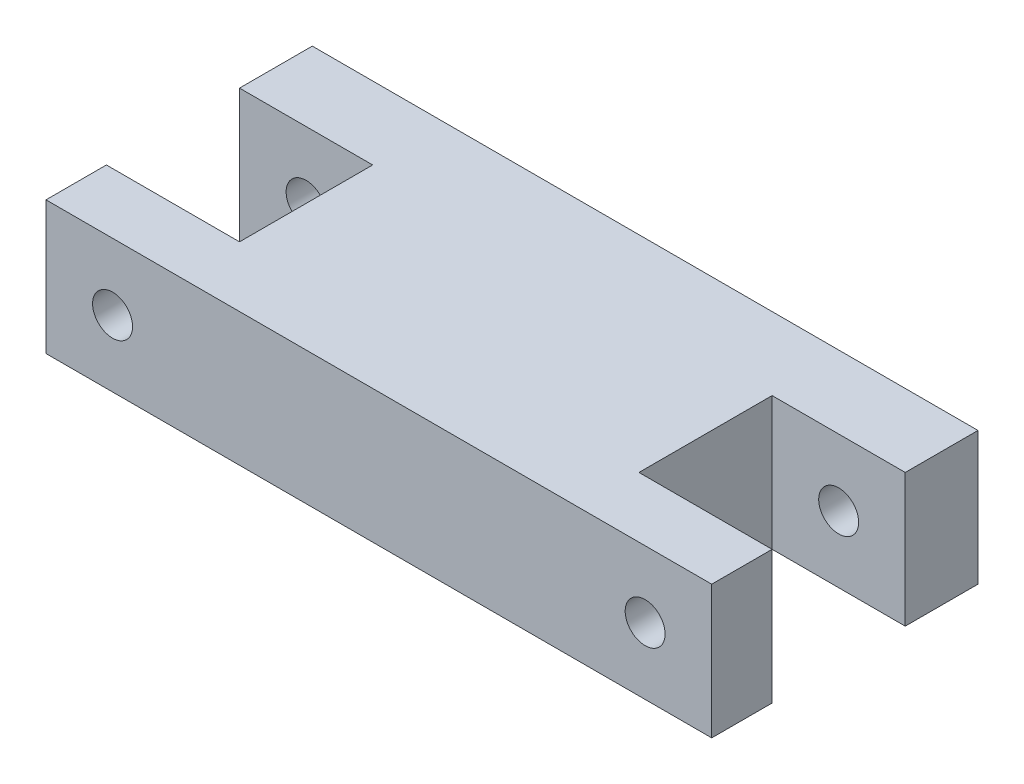
ISO-10303-21;
HEADER;
FILE_DESCRIPTION(('STEP AP214'),'2;1');
FILE_NAME('part.step','',(''),(''),'','','');
FILE_SCHEMA(('AUTOMOTIVE_DESIGN { 1 0 10303 214 1 1 1 1 }'));
ENDSEC;
DATA;
#1=APPLICATION_CONTEXT('core data for automotive mechanical design processes');
#2=APPLICATION_PROTOCOL_DEFINITION('international standard','automotive_design',2000,#1);
#3=PRODUCT_CONTEXT('',#1,'mechanical');
#4=PRODUCT('Part','Part','',(#3));
#5=PRODUCT_RELATED_PRODUCT_CATEGORY('part','',(#4));
#6=PRODUCT_DEFINITION_FORMATION('','',#4);
#7=PRODUCT_DEFINITION_CONTEXT('part definition',#1,'design');
#8=PRODUCT_DEFINITION('design','',#6,#7);
#9=PRODUCT_DEFINITION_SHAPE('','',#8);
#10=(LENGTH_UNIT() NAMED_UNIT(*) SI_UNIT(.MILLI.,.METRE.));
#11=(NAMED_UNIT(*) PLANE_ANGLE_UNIT() SI_UNIT($,.RADIAN.));
#12=(NAMED_UNIT(*) SI_UNIT($,.STERADIAN.) SOLID_ANGLE_UNIT());
#13=UNCERTAINTY_MEASURE_WITH_UNIT(LENGTH_MEASURE(1.E-05),#10,'distance_accuracy_value','');
#14=(GEOMETRIC_REPRESENTATION_CONTEXT(3) GLOBAL_UNCERTAINTY_ASSIGNED_CONTEXT((#13)) GLOBAL_UNIT_ASSIGNED_CONTEXT((#10,
#11,#12)) REPRESENTATION_CONTEXT('',''));
#15=CARTESIAN_POINT('',(0.,0.,0.));
#16=DIRECTION('',(0.,0.,1.));
#17=DIRECTION('',(1.,0.,0.));
#18=AXIS2_PLACEMENT_3D('',#15,#16,#17);
#19=CARTESIAN_POINT('',(-50.,10.,40.));
#20=DIRECTION('',(0.,-1.,0.));
#21=DIRECTION('',(0.,0.,-1.));
#22=AXIS2_PLACEMENT_3D('',#19,#20,#21);
#23=PLANE('',#22);
#24=DIRECTION('',(1.,0.,0.));
#25=VECTOR('',#24,1.);
#26=CARTESIAN_POINT('',(-50.,10.,10.9284682851718));
#27=LINE('',#26,#25);
#28=CARTESIAN_POINT('',(-50.,10.,10.9284682851718));
#29=VERTEX_POINT('',#28);
#30=CARTESIAN_POINT('',(-30.,10.,10.9284682851718));
#31=VERTEX_POINT('',#30);
#32=EDGE_CURVE('E135',#29,#31,#27,.T.);
#33=ORIENTED_EDGE('',*,*,#32,.T.);
#34=DIRECTION('',(0.,0.,1.));
#35=VECTOR('',#34,1.);
#36=CARTESIAN_POINT('',(-30.,10.,30.9284682851718));
#37=LINE('',#36,#35);
#38=CARTESIAN_POINT('',(-30.,10.,30.9284682851718));
#39=VERTEX_POINT('',#38);
#40=EDGE_CURVE('E150',#31,#39,#37,.T.);
#41=ORIENTED_EDGE('',*,*,#40,.T.);
#42=DIRECTION('',(-1.,0.,0.));
#43=VECTOR('',#42,1.);
#44=CARTESIAN_POINT('',(-50.,10.,30.9284682851717));
#45=LINE('',#44,#43);
#46=CARTESIAN_POINT('',(-50.,10.,30.9284682851717));
#47=VERTEX_POINT('',#46);
#48=EDGE_CURVE('E196',#39,#47,#45,.T.);
#49=ORIENTED_EDGE('',*,*,#48,.T.);
#50=DIRECTION('',(0.,0.,-1.));
#51=VECTOR('',#50,1.);
#52=CARTESIAN_POINT('',(-50.,10.,40.));
#53=LINE('',#52,#51);
#54=CARTESIAN_POINT('',(-50.,10.,40.));
#55=VERTEX_POINT('',#54);
#56=EDGE_CURVE('E166',#55,#47,#53,.T.);
#57=ORIENTED_EDGE('',*,*,#56,.F.);
#58=DIRECTION('',(-1.,0.,0.));
#59=VECTOR('',#58,1.);
#60=CARTESIAN_POINT('',(-50.,10.,40.));
#61=LINE('',#60,#59);
#62=CARTESIAN_POINT('',(50.,10.,40.));
#63=VERTEX_POINT('',#62);
#64=EDGE_CURVE('E233',#63,#55,#61,.T.);
#65=ORIENTED_EDGE('',*,*,#64,.F.);
#66=DIRECTION('',(0.,0.,-1.));
#67=VECTOR('',#66,1.);
#68=CARTESIAN_POINT('',(50.,10.,40.));
#69=LINE('',#68,#67);
#70=CARTESIAN_POINT('',(50.,10.,30.9284682851717));
#71=VERTEX_POINT('',#70);
#72=EDGE_CURVE('E11',#63,#71,#69,.T.);
#73=ORIENTED_EDGE('',*,*,#72,.T.);
#74=DIRECTION('',(1.,0.,0.));
#75=VECTOR('',#74,1.);
#76=CARTESIAN_POINT('',(50.,10.,30.9284682851717));
#77=LINE('',#76,#75);
#78=CARTESIAN_POINT('',(30.,10.,30.9284682851718));
#79=VERTEX_POINT('',#78);
#80=EDGE_CURVE('E210',#79,#71,#77,.T.);
#81=ORIENTED_EDGE('',*,*,#80,.F.);
#82=DIRECTION('',(0.,0.,1.));
#83=VECTOR('',#82,1.);
#84=CARTESIAN_POINT('',(30.,10.,30.9284682851718));
#85=LINE('',#84,#83);
#86=CARTESIAN_POINT('',(30.,10.,10.9284682851718));
#87=VERTEX_POINT('',#86);
#88=EDGE_CURVE('E217',#87,#79,#85,.T.);
#89=ORIENTED_EDGE('',*,*,#88,.F.);
#90=DIRECTION('',(-1.,0.,0.));
#91=VECTOR('',#90,1.);
#92=CARTESIAN_POINT('',(50.,10.,10.9284682851718));
#93=LINE('',#92,#91);
#94=CARTESIAN_POINT('',(50.,10.,10.9284682851718));
#95=VERTEX_POINT('',#94);
#96=EDGE_CURVE('E203',#95,#87,#93,.T.);
#97=ORIENTED_EDGE('',*,*,#96,.F.);
#98=CARTESIAN_POINT('',(50.,10.,0.));
#99=VERTEX_POINT('',#98);
#100=EDGE_CURVE('E47',#95,#99,#69,.T.);
#101=ORIENTED_EDGE('',*,*,#100,.T.);
#102=DIRECTION('',(-1.,0.,0.));
#103=VECTOR('',#102,1.);
#104=CARTESIAN_POINT('',(-50.,10.,0.));
#105=LINE('',#104,#103);
#106=CARTESIAN_POINT('',(-50.,10.,0.));
#107=VERTEX_POINT('',#106);
#108=EDGE_CURVE('E242',#99,#107,#105,.T.);
#109=ORIENTED_EDGE('',*,*,#108,.T.);
#110=EDGE_CURVE('E160',#29,#107,#53,.T.);
#111=ORIENTED_EDGE('',*,*,#110,.F.);
#112=EDGE_LOOP('',(#33,#41,#49,#57,#65,#73,#81,#89,#97,#101,#109,#111));
#113=FACE_BOUND('',#112,.T.);
#114=ADVANCED_FACE('F38',(#113),#23,.F.);
#115=CARTESIAN_POINT('',(-50.,10.,40.));
#116=DIRECTION('',(1.,0.,0.));
#117=DIRECTION('',(0.,1.,0.));
#118=AXIS2_PLACEMENT_3D('',#115,#116,#117);
#119=PLANE('',#118);
#120=DIRECTION('',(0.,1.,0.));
#121=VECTOR('',#120,1.);
#122=CARTESIAN_POINT('',(-50.,-10.,10.9284682851718));
#123=LINE('',#122,#121);
#124=CARTESIAN_POINT('',(-50.,-10.,10.9284682851718));
#125=VERTEX_POINT('',#124);
#126=EDGE_CURVE('E128',#125,#29,#123,.T.);
#127=ORIENTED_EDGE('',*,*,#126,.T.);
#128=ORIENTED_EDGE('',*,*,#110,.T.);
#129=DIRECTION('',(0.,-1.,0.));
#130=VECTOR('',#129,1.);
#131=CARTESIAN_POINT('',(-50.,10.,0.));
#132=LINE('',#131,#130);
#133=CARTESIAN_POINT('',(-50.,-10.,0.));
#134=VERTEX_POINT('',#133);
#135=EDGE_CURVE('E154',#107,#134,#132,.T.);
#136=ORIENTED_EDGE('',*,*,#135,.T.);
#137=DIRECTION('',(0.,0.,-1.));
#138=VECTOR('',#137,1.);
#139=CARTESIAN_POINT('',(-50.,-10.,40.));
#140=LINE('',#139,#138);
#141=EDGE_CURVE('E146',#125,#134,#140,.T.);
#142=ORIENTED_EDGE('',*,*,#141,.F.);
#143=EDGE_LOOP('',(#127,#128,#136,#142));
#144=FACE_BOUND('',#143,.T.);
#145=ADVANCED_FACE('F152',(#144),#119,.F.);
#146=DIRECTION('',(0.,1.,0.));
#147=VECTOR('',#146,1.);
#148=CARTESIAN_POINT('',(-50.,-10.,30.9284682851717));
#149=LINE('',#148,#147);
#150=CARTESIAN_POINT('',(-50.,-10.,30.9284682851717));
#151=VERTEX_POINT('',#150);
#152=EDGE_CURVE('E139',#151,#47,#149,.T.);
#153=ORIENTED_EDGE('',*,*,#152,.F.);
#154=CARTESIAN_POINT('',(-50.,-10.,40.));
#155=VERTEX_POINT('',#154);
#156=EDGE_CURVE('E156',#155,#151,#140,.T.);
#157=ORIENTED_EDGE('',*,*,#156,.F.);
#158=DIRECTION('',(0.,-1.,0.));
#159=VECTOR('',#158,1.);
#160=CARTESIAN_POINT('',(-50.,10.,40.));
#161=LINE('',#160,#159);
#162=EDGE_CURVE('E236',#55,#155,#161,.T.);
#163=ORIENTED_EDGE('',*,*,#162,.F.);
#164=ORIENTED_EDGE('',*,*,#56,.T.);
#165=EDGE_LOOP('',(#153,#157,#163,#164));
#166=FACE_BOUND('',#165,.T.);
#167=ADVANCED_FACE('F275',(#166),#119,.F.);
#168=CARTESIAN_POINT('',(-50.,-10.,40.));
#169=DIRECTION('',(0.,1.,0.));
#170=DIRECTION('',(0.,0.,1.));
#171=AXIS2_PLACEMENT_3D('',#168,#169,#170);
#172=PLANE('',#171);
#173=DIRECTION('',(1.,0.,0.));
#174=VECTOR('',#173,1.);
#175=CARTESIAN_POINT('',(-50.,-10.,10.9284682851718));
#176=LINE('',#175,#174);
#177=CARTESIAN_POINT('',(-30.,-10.,10.9284682851718));
#178=VERTEX_POINT('',#177);
#179=EDGE_CURVE('E132',#125,#178,#176,.T.);
#180=ORIENTED_EDGE('',*,*,#179,.F.);
#181=ORIENTED_EDGE('',*,*,#141,.T.);
#182=DIRECTION('',(1.,0.,0.));
#183=VECTOR('',#182,1.);
#184=CARTESIAN_POINT('',(-50.,-10.,0.));
#185=LINE('',#184,#183);
#186=CARTESIAN_POINT('',(50.,-10.,0.));
#187=VERTEX_POINT('',#186);
#188=EDGE_CURVE('E234',#134,#187,#185,.T.);
#189=ORIENTED_EDGE('',*,*,#188,.T.);
#190=DIRECTION('',(0.,0.,-1.));
#191=VECTOR('',#190,1.);
#192=CARTESIAN_POINT('',(50.,-10.,40.));
#193=LINE('',#192,#191);
#194=CARTESIAN_POINT('',(50.,-10.,10.9284682851718));
#195=VERTEX_POINT('',#194);
#196=EDGE_CURVE('E162',#195,#187,#193,.T.);
#197=ORIENTED_EDGE('',*,*,#196,.F.);
#198=DIRECTION('',(-1.,0.,0.));
#199=VECTOR('',#198,1.);
#200=CARTESIAN_POINT('',(50.,-10.,10.9284682851718));
#201=LINE('',#200,#199);
#202=CARTESIAN_POINT('',(30.,-10.,10.9284682851718));
#203=VERTEX_POINT('',#202);
#204=EDGE_CURVE('E206',#195,#203,#201,.T.);
#205=ORIENTED_EDGE('',*,*,#204,.T.);
#206=DIRECTION('',(0.,0.,1.));
#207=VECTOR('',#206,1.);
#208=CARTESIAN_POINT('',(30.,-10.,30.9284682851718));
#209=LINE('',#208,#207);
#210=CARTESIAN_POINT('',(30.,-10.,30.9284682851718));
#211=VERTEX_POINT('',#210);
#212=EDGE_CURVE('E209',#203,#211,#209,.T.);
#213=ORIENTED_EDGE('',*,*,#212,.T.);
#214=DIRECTION('',(1.,0.,0.));
#215=VECTOR('',#214,1.);
#216=CARTESIAN_POINT('',(50.,-10.,30.9284682851717));
#217=LINE('',#216,#215);
#218=CARTESIAN_POINT('',(50.,-10.,30.9284682851717));
#219=VERTEX_POINT('',#218);
#220=EDGE_CURVE('E63',#211,#219,#217,.T.);
#221=ORIENTED_EDGE('',*,*,#220,.T.);
#222=CARTESIAN_POINT('',(50.,-10.,40.));
#223=VERTEX_POINT('',#222);
#224=EDGE_CURVE('E157',#223,#219,#193,.T.);
#225=ORIENTED_EDGE('',*,*,#224,.F.);
#226=DIRECTION('',(1.,0.,0.));
#227=VECTOR('',#226,1.);
#228=CARTESIAN_POINT('',(-50.,-10.,40.));
#229=LINE('',#228,#227);
#230=EDGE_CURVE('E238',#155,#223,#229,.T.);
#231=ORIENTED_EDGE('',*,*,#230,.F.);
#232=ORIENTED_EDGE('',*,*,#156,.T.);
#233=DIRECTION('',(-1.,0.,0.));
#234=VECTOR('',#233,1.);
#235=CARTESIAN_POINT('',(-50.,-10.,30.9284682851717));
#236=LINE('',#235,#234);
#237=CARTESIAN_POINT('',(-30.,-10.,30.9284682851718));
#238=VERTEX_POINT('',#237);
#239=EDGE_CURVE('E149',#238,#151,#236,.T.);
#240=ORIENTED_EDGE('',*,*,#239,.F.);
#241=DIRECTION('',(0.,0.,1.));
#242=VECTOR('',#241,1.);
#243=CARTESIAN_POINT('',(-30.,-10.,30.9284682851718));
#244=LINE('',#243,#242);
#245=EDGE_CURVE('E140',#178,#238,#244,.T.);
#246=ORIENTED_EDGE('',*,*,#245,.F.);
#247=EDGE_LOOP('',(#180,#181,#189,#197,#205,#213,#221,#225,#231,#232,#240,#246));
#248=FACE_BOUND('',#247,.T.);
#249=ADVANCED_FACE('F144',(#248),#172,.F.);
#250=CARTESIAN_POINT('',(50.,10.,40.));
#251=DIRECTION('',(-1.,0.,0.));
#252=DIRECTION('',(0.,0.,1.));
#253=AXIS2_PLACEMENT_3D('',#250,#251,#252);
#254=PLANE('',#253);
#255=ORIENTED_EDGE('',*,*,#100,.F.);
#256=DIRECTION('',(0.,1.,0.));
#257=VECTOR('',#256,1.);
#258=CARTESIAN_POINT('',(50.,-10.,10.9284682851718));
#259=LINE('',#258,#257);
#260=EDGE_CURVE('E221',#195,#95,#259,.T.);
#261=ORIENTED_EDGE('',*,*,#260,.F.);
#262=ORIENTED_EDGE('',*,*,#196,.T.);
#263=DIRECTION('',(0.,1.,0.));
#264=VECTOR('',#263,1.);
#265=CARTESIAN_POINT('',(50.,10.,0.));
#266=LINE('',#265,#264);
#267=EDGE_CURVE('E223',#187,#99,#266,.T.);
#268=ORIENTED_EDGE('',*,*,#267,.T.);
#269=EDGE_LOOP('',(#255,#261,#262,#268));
#270=FACE_BOUND('',#269,.T.);
#271=ADVANCED_FACE('F252',(#270),#254,.F.);
#272=ORIENTED_EDGE('',*,*,#224,.T.);
#273=DIRECTION('',(0.,1.,0.));
#274=VECTOR('',#273,1.);
#275=CARTESIAN_POINT('',(50.,-10.,30.9284682851717));
#276=LINE('',#275,#274);
#277=EDGE_CURVE('E224',#219,#71,#276,.T.);
#278=ORIENTED_EDGE('',*,*,#277,.T.);
#279=ORIENTED_EDGE('',*,*,#72,.F.);
#280=DIRECTION('',(0.,1.,0.));
#281=VECTOR('',#280,1.);
#282=CARTESIAN_POINT('',(50.,10.,40.));
#283=LINE('',#282,#281);
#284=EDGE_CURVE('E230',#223,#63,#283,.T.);
#285=ORIENTED_EDGE('',*,*,#284,.F.);
#286=EDGE_LOOP('',(#272,#278,#279,#285));
#287=FACE_BOUND('',#286,.T.);
#288=ADVANCED_FACE('F40',(#287),#254,.F.);
#289=CARTESIAN_POINT('',(0.,0.,40.));
#290=DIRECTION('',(0.,0.,1.));
#291=DIRECTION('',(1.,0.,0.));
#292=AXIS2_PLACEMENT_3D('',#289,#290,#291);
#293=PLANE('',#292);
#294=CARTESIAN_POINT('',(-40.,0.,40.));
#295=DIRECTION('',(0.,0.,-1.));
#296=DIRECTION('',(-1.,0.,0.));
#297=AXIS2_PLACEMENT_3D('',#294,#295,#296);
#298=CIRCLE('',#297,3.);
#299=CARTESIAN_POINT('',(-43.,0.,40.));
#300=VERTEX_POINT('',#299);
#301=EDGE_CURVE('E182',#300,#300,#298,.T.);
#302=ORIENTED_EDGE('',*,*,#301,.T.);
#303=EDGE_LOOP('',(#302));
#304=FACE_BOUND('',#303,.T.);
#305=CARTESIAN_POINT('',(40.,0.,40.));
#306=DIRECTION('',(0.,0.,1.));
#307=DIRECTION('',(1.,0.,0.));
#308=AXIS2_PLACEMENT_3D('',#305,#306,#307);
#309=CIRCLE('',#308,3.);
#310=CARTESIAN_POINT('',(43.,0.,40.));
#311=VERTEX_POINT('',#310);
#312=EDGE_CURVE('E171',#311,#311,#309,.T.);
#313=ORIENTED_EDGE('',*,*,#312,.F.);
#314=EDGE_LOOP('',(#313));
#315=FACE_BOUND('',#314,.T.);
#316=ORIENTED_EDGE('',*,*,#284,.T.);
#317=ORIENTED_EDGE('',*,*,#64,.T.);
#318=ORIENTED_EDGE('',*,*,#162,.T.);
#319=ORIENTED_EDGE('',*,*,#230,.T.);
#320=EDGE_LOOP('',(#316,#317,#318,#319));
#321=FACE_BOUND('',#320,.T.);
#322=ADVANCED_FACE('F269',(#304,#315,#321),#293,.T.);
#323=CARTESIAN_POINT('',(0.,0.,0.));
#324=DIRECTION('',(0.,0.,1.));
#325=DIRECTION('',(1.,0.,0.));
#326=AXIS2_PLACEMENT_3D('',#323,#324,#325);
#327=PLANE('',#326);
#328=CARTESIAN_POINT('',(-40.,0.,0.));
#329=DIRECTION('',(0.,0.,-1.));
#330=DIRECTION('',(-1.,0.,0.));
#331=AXIS2_PLACEMENT_3D('',#328,#329,#330);
#332=CIRCLE('',#331,3.);
#333=CARTESIAN_POINT('',(-43.,0.,0.));
#334=VERTEX_POINT('',#333);
#335=EDGE_CURVE('E175',#334,#334,#332,.T.);
#336=ORIENTED_EDGE('',*,*,#335,.F.);
#337=EDGE_LOOP('',(#336));
#338=FACE_BOUND('',#337,.T.);
#339=CARTESIAN_POINT('',(40.,0.,0.));
#340=DIRECTION('',(0.,0.,1.));
#341=DIRECTION('',(1.,0.,0.));
#342=AXIS2_PLACEMENT_3D('',#339,#340,#341);
#343=CIRCLE('',#342,3.);
#344=CARTESIAN_POINT('',(43.,0.,0.));
#345=VERTEX_POINT('',#344);
#346=EDGE_CURVE('E188',#345,#345,#343,.T.);
#347=ORIENTED_EDGE('',*,*,#346,.T.);
#348=EDGE_LOOP('',(#347));
#349=FACE_BOUND('',#348,.T.);
#350=ORIENTED_EDGE('',*,*,#267,.F.);
#351=ORIENTED_EDGE('',*,*,#188,.F.);
#352=ORIENTED_EDGE('',*,*,#135,.F.);
#353=ORIENTED_EDGE('',*,*,#108,.F.);
#354=EDGE_LOOP('',(#350,#351,#352,#353));
#355=FACE_BOUND('',#354,.T.);
#356=ADVANCED_FACE('F249',(#338,#349,#355),#327,.F.);
#357=CARTESIAN_POINT('',(50.,-10.,10.9284682851718));
#358=DIRECTION('',(0.,0.,-1.));
#359=DIRECTION('',(-1.,0.,0.));
#360=AXIS2_PLACEMENT_3D('',#357,#358,#359);
#361=PLANE('',#360);
#362=CARTESIAN_POINT('',(40.,0.,10.9284682851718));
#363=DIRECTION('',(0.,0.,1.));
#364=DIRECTION('',(1.,0.,0.));
#365=AXIS2_PLACEMENT_3D('',#362,#363,#364);
#366=CIRCLE('',#365,3.);
#367=CARTESIAN_POINT('',(43.,0.,10.9284682851718));
#368=VERTEX_POINT('',#367);
#369=EDGE_CURVE('E186',#368,#368,#366,.T.);
#370=ORIENTED_EDGE('',*,*,#369,.F.);
#371=EDGE_LOOP('',(#370));
#372=FACE_BOUND('',#371,.T.);
#373=ORIENTED_EDGE('',*,*,#96,.T.);
#374=DIRECTION('',(0.,1.,0.));
#375=VECTOR('',#374,1.);
#376=CARTESIAN_POINT('',(30.,-10.,10.9284682851718));
#377=LINE('',#376,#375);
#378=EDGE_CURVE('E214',#203,#87,#377,.T.);
#379=ORIENTED_EDGE('',*,*,#378,.F.);
#380=ORIENTED_EDGE('',*,*,#204,.F.);
#381=ORIENTED_EDGE('',*,*,#260,.T.);
#382=EDGE_LOOP('',(#373,#379,#380,#381));
#383=FACE_BOUND('',#382,.T.);
#384=ADVANCED_FACE('F256',(#372,#383),#361,.F.);
#385=CARTESIAN_POINT('',(50.,-10.,30.9284682851717));
#386=DIRECTION('',(0.,0.,1.));
#387=DIRECTION('',(1.,0.,0.));
#388=AXIS2_PLACEMENT_3D('',#385,#386,#387);
#389=PLANE('',#388);
#390=CARTESIAN_POINT('',(40.,0.,30.9284682851718));
#391=DIRECTION('',(0.,0.,1.));
#392=DIRECTION('',(1.,0.,0.));
#393=AXIS2_PLACEMENT_3D('',#390,#391,#392);
#394=CIRCLE('',#393,3.);
#395=CARTESIAN_POINT('',(43.,0.,30.9284682851718));
#396=VERTEX_POINT('',#395);
#397=EDGE_CURVE('E168',#396,#396,#394,.F.);
#398=ORIENTED_EDGE('',*,*,#397,.F.);
#399=EDGE_LOOP('',(#398));
#400=FACE_BOUND('',#399,.T.);
#401=ORIENTED_EDGE('',*,*,#80,.T.);
#402=ORIENTED_EDGE('',*,*,#277,.F.);
#403=ORIENTED_EDGE('',*,*,#220,.F.);
#404=DIRECTION('',(0.,1.,0.));
#405=VECTOR('',#404,1.);
#406=CARTESIAN_POINT('',(30.,-10.,30.9284682851718));
#407=LINE('',#406,#405);
#408=EDGE_CURVE('E227',#211,#79,#407,.T.);
#409=ORIENTED_EDGE('',*,*,#408,.T.);
#410=EDGE_LOOP('',(#401,#402,#403,#409));
#411=FACE_BOUND('',#410,.T.);
#412=ADVANCED_FACE('F307',(#400,#411),#389,.F.);
#413=CARTESIAN_POINT('',(30.,-10.,30.9284682851718));
#414=DIRECTION('',(-1.,0.,0.));
#415=DIRECTION('',(0.,0.,1.));
#416=AXIS2_PLACEMENT_3D('',#413,#414,#415);
#417=PLANE('',#416);
#418=ORIENTED_EDGE('',*,*,#88,.T.);
#419=ORIENTED_EDGE('',*,*,#408,.F.);
#420=ORIENTED_EDGE('',*,*,#212,.F.);
#421=ORIENTED_EDGE('',*,*,#378,.T.);
#422=EDGE_LOOP('',(#418,#419,#420,#421));
#423=FACE_BOUND('',#422,.T.);
#424=ADVANCED_FACE('F261',(#423),#417,.F.);
#425=CARTESIAN_POINT('',(-50.,-10.,10.9284682851718));
#426=DIRECTION('',(0.,0.,1.));
#427=DIRECTION('',(1.,0.,0.));
#428=AXIS2_PLACEMENT_3D('',#425,#426,#427);
#429=PLANE('',#428);
#430=CARTESIAN_POINT('',(-40.,0.,10.9284682851718));
#431=DIRECTION('',(0.,0.,-1.));
#432=DIRECTION('',(-1.,0.,0.));
#433=AXIS2_PLACEMENT_3D('',#430,#431,#432);
#434=CIRCLE('',#433,3.);
#435=CARTESIAN_POINT('',(-43.,0.,10.9284682851718));
#436=VERTEX_POINT('',#435);
#437=EDGE_CURVE('E170',#436,#436,#434,.T.);
#438=ORIENTED_EDGE('',*,*,#437,.T.);
#439=EDGE_LOOP('',(#438));
#440=FACE_BOUND('',#439,.T.);
#441=ORIENTED_EDGE('',*,*,#32,.F.);
#442=ORIENTED_EDGE('',*,*,#126,.F.);
#443=ORIENTED_EDGE('',*,*,#179,.T.);
#444=DIRECTION('',(0.,1.,0.));
#445=VECTOR('',#444,1.);
#446=CARTESIAN_POINT('',(-30.,-10.,10.9284682851718));
#447=LINE('',#446,#445);
#448=EDGE_CURVE('E201',#178,#31,#447,.T.);
#449=ORIENTED_EDGE('',*,*,#448,.T.);
#450=EDGE_LOOP('',(#441,#442,#443,#449));
#451=FACE_BOUND('',#450,.T.);
#452=ADVANCED_FACE('F130',(#440,#451),#429,.T.);
#453=CARTESIAN_POINT('',(-30.,-10.,30.9284682851718));
#454=DIRECTION('',(-1.,0.,0.));
#455=DIRECTION('',(0.,0.,1.));
#456=AXIS2_PLACEMENT_3D('',#453,#454,#455);
#457=PLANE('',#456);
#458=ORIENTED_EDGE('',*,*,#40,.F.);
#459=ORIENTED_EDGE('',*,*,#448,.F.);
#460=ORIENTED_EDGE('',*,*,#245,.T.);
#461=DIRECTION('',(0.,1.,0.));
#462=VECTOR('',#461,1.);
#463=CARTESIAN_POINT('',(-30.,-10.,30.9284682851718));
#464=LINE('',#463,#462);
#465=EDGE_CURVE('E55',#238,#39,#464,.T.);
#466=ORIENTED_EDGE('',*,*,#465,.T.);
#467=EDGE_LOOP('',(#458,#459,#460,#466));
#468=FACE_BOUND('',#467,.T.);
#469=ADVANCED_FACE('F278',(#468),#457,.T.);
#470=CARTESIAN_POINT('',(-50.,-10.,30.9284682851717));
#471=DIRECTION('',(0.,0.,-1.));
#472=DIRECTION('',(-1.,0.,0.));
#473=AXIS2_PLACEMENT_3D('',#470,#471,#472);
#474=PLANE('',#473);
#475=CARTESIAN_POINT('',(-40.,0.,30.9284682851718));
#476=DIRECTION('',(0.,0.,-1.));
#477=DIRECTION('',(-1.,0.,0.));
#478=AXIS2_PLACEMENT_3D('',#475,#476,#477);
#479=CIRCLE('',#478,3.);
#480=CARTESIAN_POINT('',(-43.,0.,30.9284682851718));
#481=VERTEX_POINT('',#480);
#482=EDGE_CURVE('E42',#481,#481,#479,.T.);
#483=ORIENTED_EDGE('',*,*,#482,.F.);
#484=EDGE_LOOP('',(#483));
#485=FACE_BOUND('',#484,.T.);
#486=ORIENTED_EDGE('',*,*,#48,.F.);
#487=ORIENTED_EDGE('',*,*,#465,.F.);
#488=ORIENTED_EDGE('',*,*,#239,.T.);
#489=ORIENTED_EDGE('',*,*,#152,.T.);
#490=EDGE_LOOP('',(#486,#487,#488,#489));
#491=FACE_BOUND('',#490,.T.);
#492=ADVANCED_FACE('F276',(#485,#491),#474,.T.);
#493=CARTESIAN_POINT('',(40.,0.,0.));
#494=DIRECTION('',(0.,0.,1.));
#495=DIRECTION('',(1.,0.,0.));
#496=AXIS2_PLACEMENT_3D('',#493,#494,#495);
#497=CYLINDRICAL_SURFACE('',#496,3.);
#498=ORIENTED_EDGE('',*,*,#346,.F.);
#499=EDGE_LOOP('',(#498));
#500=FACE_BOUND('',#499,.T.);
#501=ORIENTED_EDGE('',*,*,#369,.T.);
#502=EDGE_LOOP('',(#501));
#503=FACE_BOUND('',#502,.T.);
#504=ADVANCED_FACE('F285',(#500,#503),#497,.F.);
#505=CARTESIAN_POINT('',(-40.,0.,0.));
#506=DIRECTION('',(0.,0.,1.));
#507=DIRECTION('',(1.,0.,0.));
#508=AXIS2_PLACEMENT_3D('',#505,#506,#507);
#509=CYLINDRICAL_SURFACE('',#508,3.);
#510=ORIENTED_EDGE('',*,*,#335,.T.);
#511=EDGE_LOOP('',(#510));
#512=FACE_BOUND('',#511,.T.);
#513=ORIENTED_EDGE('',*,*,#437,.F.);
#514=EDGE_LOOP('',(#513));
#515=FACE_BOUND('',#514,.T.);
#516=ADVANCED_FACE('F340',(#512,#515),#509,.F.);
#517=CARTESIAN_POINT('',(40.,0.,40.));
#518=DIRECTION('',(0.,0.,-1.));
#519=DIRECTION('',(-1.,0.,0.));
#520=AXIS2_PLACEMENT_3D('',#517,#518,#519);
#521=CYLINDRICAL_SURFACE('',#520,3.);
#522=ORIENTED_EDGE('',*,*,#312,.T.);
#523=EDGE_LOOP('',(#522));
#524=FACE_BOUND('',#523,.T.);
#525=ORIENTED_EDGE('',*,*,#397,.T.);
#526=EDGE_LOOP('',(#525));
#527=FACE_BOUND('',#526,.T.);
#528=ADVANCED_FACE('F344',(#524,#527),#521,.F.);
#529=CARTESIAN_POINT('',(-40.,0.,40.));
#530=DIRECTION('',(0.,0.,-1.));
#531=DIRECTION('',(-1.,0.,0.));
#532=AXIS2_PLACEMENT_3D('',#529,#530,#531);
#533=CYLINDRICAL_SURFACE('',#532,3.);
#534=ORIENTED_EDGE('',*,*,#482,.T.);
#535=EDGE_LOOP('',(#534));
#536=FACE_BOUND('',#535,.T.);
#537=ORIENTED_EDGE('',*,*,#301,.F.);
#538=EDGE_LOOP('',(#537));
#539=FACE_BOUND('',#538,.T.);
#540=ADVANCED_FACE('F410',(#536,#539),#533,.F.);
#541=CLOSED_SHELL('',(#114,#145,#167,#249,#271,#288,#322,#356,#384,#412,#424,#452,#469,#492,
#504,#516,#528,#540));
#542=MANIFOLD_SOLID_BREP('B2',#541);
#543=ADVANCED_BREP_SHAPE_REPRESENTATION('',(#18,#542),#14);
#544=SHAPE_DEFINITION_REPRESENTATION(#9,#543);
ENDSEC;
END-ISO-10303-21;
